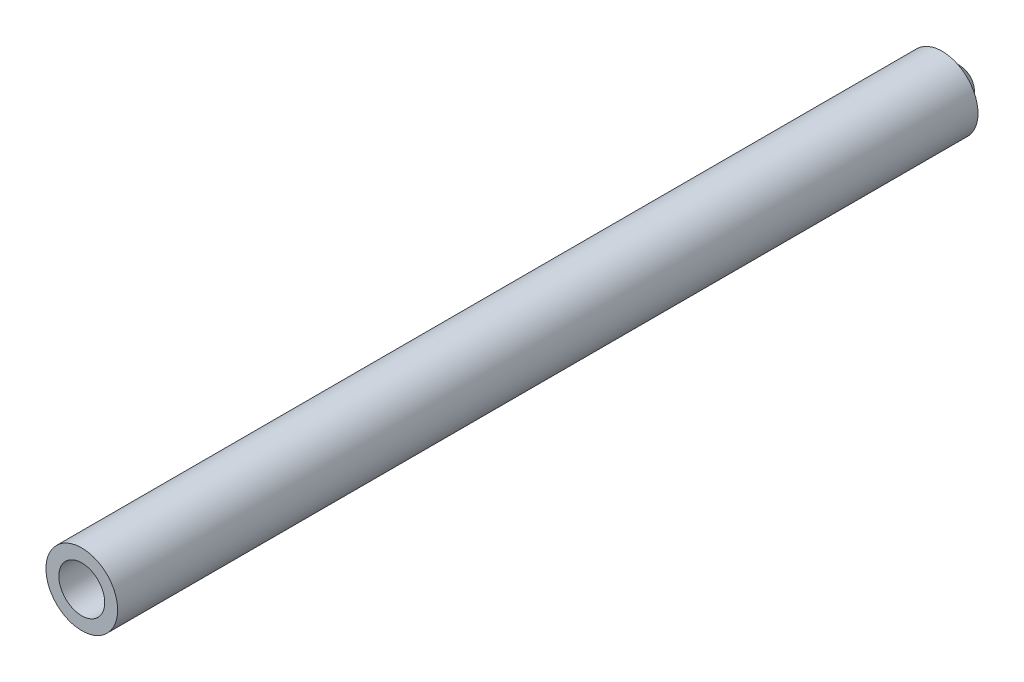
ISO-10303-21;
HEADER;
FILE_DESCRIPTION(('STEP AP214'),'2;1');
FILE_NAME('part.step','',(''),(''),'','','');
FILE_SCHEMA(('AUTOMOTIVE_DESIGN { 1 0 10303 214 1 1 1 1 }'));
ENDSEC;
DATA;
#1=APPLICATION_CONTEXT('core data for automotive mechanical design processes');
#2=APPLICATION_PROTOCOL_DEFINITION('international standard','automotive_design',2000,#1);
#3=PRODUCT_CONTEXT('',#1,'mechanical');
#4=PRODUCT('Part','Part','',(#3));
#5=PRODUCT_RELATED_PRODUCT_CATEGORY('part','',(#4));
#6=PRODUCT_DEFINITION_FORMATION('','',#4);
#7=PRODUCT_DEFINITION_CONTEXT('part definition',#1,'design');
#8=PRODUCT_DEFINITION('design','',#6,#7);
#9=PRODUCT_DEFINITION_SHAPE('','',#8);
#10=(LENGTH_UNIT() NAMED_UNIT(*) SI_UNIT(.MILLI.,.METRE.));
#11=(NAMED_UNIT(*) PLANE_ANGLE_UNIT() SI_UNIT($,.RADIAN.));
#12=(NAMED_UNIT(*) SI_UNIT($,.STERADIAN.) SOLID_ANGLE_UNIT());
#13=UNCERTAINTY_MEASURE_WITH_UNIT(LENGTH_MEASURE(1.E-05),#10,'distance_accuracy_value','');
#14=(GEOMETRIC_REPRESENTATION_CONTEXT(3) GLOBAL_UNCERTAINTY_ASSIGNED_CONTEXT((#13)) GLOBAL_UNIT_ASSIGNED_CONTEXT((#10,
#11,#12)) REPRESENTATION_CONTEXT('',''));
#15=CARTESIAN_POINT('',(0.,0.,0.));
#16=DIRECTION('',(0.,0.,1.));
#17=DIRECTION('',(1.,0.,0.));
#18=AXIS2_PLACEMENT_3D('',#15,#16,#17);
#19=CARTESIAN_POINT('',(0.,0.,0.));
#20=DIRECTION('',(1.,0.,0.));
#21=DIRECTION('',(0.,1.,0.));
#22=AXIS2_PLACEMENT_3D('',#19,#20,#21);
#23=SPHERICAL_SURFACE('',#22,40.);
#24=CARTESIAN_POINT('',(40.,0.,0.));
#25=VERTEX_POINT('',#24);
#26=VERTEX_LOOP('',#25);
#27=FACE_BOUND('',#26,.T.);
#28=ADVANCED_FACE('F37',(#27),#23,.T.);
#29=CLOSED_SHELL('',(#28));
#30=MANIFOLD_SOLID_BREP('B2',#29);
#31=CARTESIAN_POINT('',(0.,0.,1500.));
#32=DIRECTION('',(0.,0.,1.));
#33=DIRECTION('',(1.,0.,0.));
#34=AXIS2_PLACEMENT_3D('',#31,#32,#33);
#35=PLANE('',#34);
#36=CARTESIAN_POINT('',(0.,0.,1500.));
#37=DIRECTION('',(0.,0.,1.));
#38=DIRECTION('',(1.,0.,0.));
#39=AXIS2_PLACEMENT_3D('',#36,#37,#38);
#40=CIRCLE('',#39,62.5);
#41=CARTESIAN_POINT('',(62.5,0.,1500.));
#42=VERTEX_POINT('',#41);
#43=EDGE_CURVE('E36',#42,#42,#40,.T.);
#44=ORIENTED_EDGE('',*,*,#43,.T.);
#45=EDGE_LOOP('',(#44));
#46=FACE_BOUND('',#45,.T.);
#47=CARTESIAN_POINT('',(0.,0.,1500.));
#48=DIRECTION('',(0.,0.,1.));
#49=DIRECTION('',(1.,0.,0.));
#50=AXIS2_PLACEMENT_3D('',#47,#48,#49);
#51=CIRCLE('',#50,40.);
#52=CARTESIAN_POINT('',(40.,0.,1500.));
#53=VERTEX_POINT('',#52);
#54=EDGE_CURVE('E61',#53,#53,#51,.T.);
#55=ORIENTED_EDGE('',*,*,#54,.F.);
#56=EDGE_LOOP('',(#55));
#57=FACE_BOUND('',#56,.T.);
#58=ADVANCED_FACE('F50',(#46,#57),#35,.T.);
#59=CARTESIAN_POINT('',(0.,0.,0.));
#60=DIRECTION('',(0.,0.,1.));
#61=DIRECTION('',(1.,0.,0.));
#62=AXIS2_PLACEMENT_3D('',#59,#60,#61);
#63=PLANE('',#62);
#64=CARTESIAN_POINT('',(0.,0.,0.));
#65=DIRECTION('',(0.,0.,1.));
#66=DIRECTION('',(1.,0.,0.));
#67=AXIS2_PLACEMENT_3D('',#64,#65,#66);
#68=CIRCLE('',#67,62.5);
#69=CARTESIAN_POINT('',(62.5,0.,0.));
#70=VERTEX_POINT('',#69);
#71=EDGE_CURVE('E54',#70,#70,#68,.T.);
#72=ORIENTED_EDGE('',*,*,#71,.F.);
#73=EDGE_LOOP('',(#72));
#74=FACE_BOUND('',#73,.T.);
#75=CARTESIAN_POINT('',(0.,0.,0.));
#76=DIRECTION('',(0.,0.,1.));
#77=DIRECTION('',(1.,0.,0.));
#78=AXIS2_PLACEMENT_3D('',#75,#76,#77);
#79=CIRCLE('',#78,40.);
#80=CARTESIAN_POINT('',(40.,0.,0.));
#81=VERTEX_POINT('',#80);
#82=EDGE_CURVE('E63',#81,#81,#79,.T.);
#83=ORIENTED_EDGE('',*,*,#82,.T.);
#84=EDGE_LOOP('',(#83));
#85=FACE_BOUND('',#84,.T.);
#86=ADVANCED_FACE('F73',(#74,#85),#63,.F.);
#87=CARTESIAN_POINT('',(0.,0.,1500.));
#88=DIRECTION('',(0.,0.,-1.));
#89=DIRECTION('',(-1.,0.,0.));
#90=AXIS2_PLACEMENT_3D('',#87,#88,#89);
#91=CYLINDRICAL_SURFACE('',#90,62.5);
#92=ORIENTED_EDGE('',*,*,#43,.F.);
#93=EDGE_LOOP('',(#92));
#94=FACE_BOUND('',#93,.T.);
#95=ORIENTED_EDGE('',*,*,#71,.T.);
#96=EDGE_LOOP('',(#95));
#97=FACE_BOUND('',#96,.T.);
#98=ADVANCED_FACE('F52',(#94,#97),#91,.T.);
#99=CARTESIAN_POINT('',(0.,0.,1500.));
#100=DIRECTION('',(0.,0.,-1.));
#101=DIRECTION('',(-1.,0.,0.));
#102=AXIS2_PLACEMENT_3D('',#99,#100,#101);
#103=CYLINDRICAL_SURFACE('',#102,40.);
#104=ORIENTED_EDGE('',*,*,#54,.T.);
#105=EDGE_LOOP('',(#104));
#106=FACE_BOUND('',#105,.T.);
#107=ORIENTED_EDGE('',*,*,#82,.F.);
#108=EDGE_LOOP('',(#107));
#109=FACE_BOUND('',#108,.T.);
#110=ADVANCED_FACE('F69',(#106,#109),#103,.F.);
#111=CLOSED_SHELL('',(#58,#86,#98,#110));
#112=MANIFOLD_SOLID_BREP('B6',#111);
#113=ADVANCED_BREP_SHAPE_REPRESENTATION('',(#18,#30,#112),#14);
#114=SHAPE_DEFINITION_REPRESENTATION(#9,#113);
ENDSEC;
END-ISO-10303-21;
